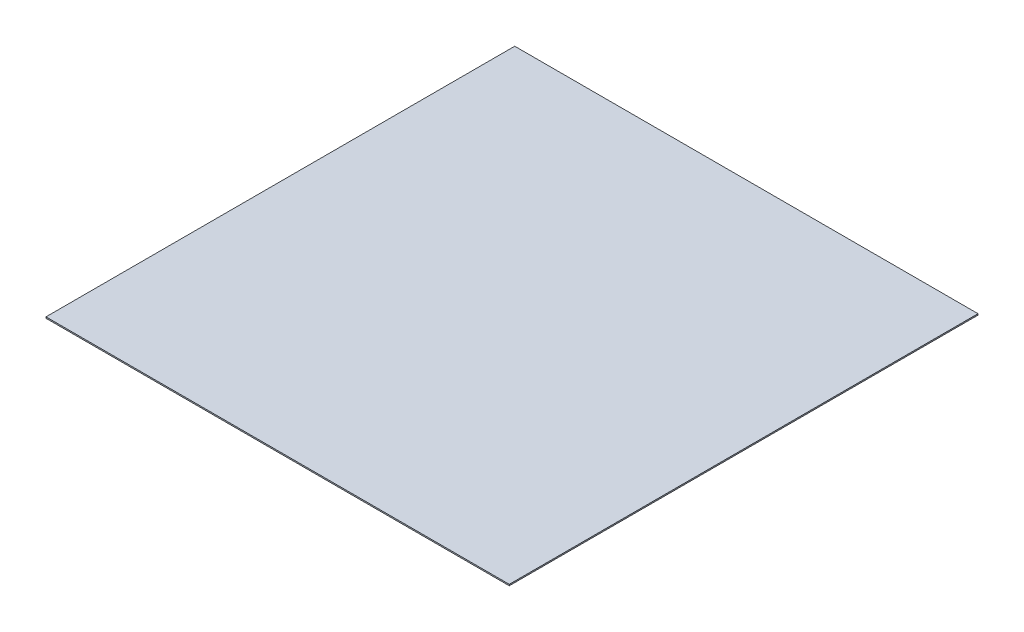
ISO-10303-21;
HEADER;
FILE_DESCRIPTION(('STEP AP214'),'2;1');
FILE_NAME('part.step','',(''),(''),'','','');
FILE_SCHEMA(('AUTOMOTIVE_DESIGN { 1 0 10303 214 1 1 1 1 }'));
ENDSEC;
DATA;
#1=APPLICATION_CONTEXT('core data for automotive mechanical design processes');
#2=APPLICATION_PROTOCOL_DEFINITION('international standard','automotive_design',2000,#1);
#3=PRODUCT_CONTEXT('',#1,'mechanical');
#4=PRODUCT('Part','Part','',(#3));
#5=PRODUCT_RELATED_PRODUCT_CATEGORY('part','',(#4));
#6=PRODUCT_DEFINITION_FORMATION('','',#4);
#7=PRODUCT_DEFINITION_CONTEXT('part definition',#1,'design');
#8=PRODUCT_DEFINITION('design','',#6,#7);
#9=PRODUCT_DEFINITION_SHAPE('','',#8);
#10=(LENGTH_UNIT() NAMED_UNIT(*) SI_UNIT(.MILLI.,.METRE.));
#11=(NAMED_UNIT(*) PLANE_ANGLE_UNIT() SI_UNIT($,.RADIAN.));
#12=(NAMED_UNIT(*) SI_UNIT($,.STERADIAN.) SOLID_ANGLE_UNIT());
#13=UNCERTAINTY_MEASURE_WITH_UNIT(LENGTH_MEASURE(1.E-05),#10,'distance_accuracy_value','');
#14=(GEOMETRIC_REPRESENTATION_CONTEXT(3) GLOBAL_UNCERTAINTY_ASSIGNED_CONTEXT((#13)) GLOBAL_UNIT_ASSIGNED_CONTEXT((#10,
#11,#12)) REPRESENTATION_CONTEXT('',''));
#15=CARTESIAN_POINT('',(0.,0.,0.));
#16=DIRECTION('',(0.,0.,1.));
#17=DIRECTION('',(1.,0.,0.));
#18=AXIS2_PLACEMENT_3D('',#15,#16,#17);
#19=CARTESIAN_POINT('',(895.,5.,-905.55));
#20=DIRECTION('',(-1.,0.,0.));
#21=DIRECTION('',(0.,0.,1.));
#22=AXIS2_PLACEMENT_3D('',#19,#20,#21);
#23=PLANE('',#22);
#24=DIRECTION('',(0.,0.,-1.));
#25=VECTOR('',#24,1.);
#26=CARTESIAN_POINT('',(895.,0.,-905.55));
#27=LINE('',#26,#25);
#28=CARTESIAN_POINT('',(895.,0.,905.55));
#29=VERTEX_POINT('',#28);
#30=CARTESIAN_POINT('',(895.,0.,-905.55));
#31=VERTEX_POINT('',#30);
#32=EDGE_CURVE('E95',#29,#31,#27,.T.);
#33=ORIENTED_EDGE('',*,*,#32,.T.);
#34=DIRECTION('',(0.,-1.,0.));
#35=VECTOR('',#34,1.);
#36=CARTESIAN_POINT('',(895.,5.,-905.55));
#37=LINE('',#36,#35);
#38=CARTESIAN_POINT('',(895.,5.,-905.55));
#39=VERTEX_POINT('',#38);
#40=EDGE_CURVE('E11',#39,#31,#37,.T.);
#41=ORIENTED_EDGE('',*,*,#40,.F.);
#42=DIRECTION('',(0.,0.,-1.));
#43=VECTOR('',#42,1.);
#44=CARTESIAN_POINT('',(895.,5.,-905.55));
#45=LINE('',#44,#43);
#46=CARTESIAN_POINT('',(895.,5.,905.55));
#47=VERTEX_POINT('',#46);
#48=EDGE_CURVE('E83',#47,#39,#45,.T.);
#49=ORIENTED_EDGE('',*,*,#48,.F.);
#50=DIRECTION('',(0.,-1.,0.));
#51=VECTOR('',#50,1.);
#52=CARTESIAN_POINT('',(895.,5.,905.55));
#53=LINE('',#52,#51);
#54=EDGE_CURVE('E91',#47,#29,#53,.T.);
#55=ORIENTED_EDGE('',*,*,#54,.T.);
#56=EDGE_LOOP('',(#33,#41,#49,#55));
#57=FACE_BOUND('',#56,.T.);
#58=ADVANCED_FACE('F32',(#57),#23,.F.);
#59=CARTESIAN_POINT('',(-895.,5.,-905.55));
#60=DIRECTION('',(0.,0.,1.));
#61=DIRECTION('',(1.,0.,0.));
#62=AXIS2_PLACEMENT_3D('',#59,#60,#61);
#63=PLANE('',#62);
#64=DIRECTION('',(-1.,0.,0.));
#65=VECTOR('',#64,1.);
#66=CARTESIAN_POINT('',(-895.,0.,-905.55));
#67=LINE('',#66,#65);
#68=CARTESIAN_POINT('',(-895.,0.,-905.55));
#69=VERTEX_POINT('',#68);
#70=EDGE_CURVE('E87',#31,#69,#67,.T.);
#71=ORIENTED_EDGE('',*,*,#70,.T.);
#72=DIRECTION('',(0.,-1.,0.));
#73=VECTOR('',#72,1.);
#74=CARTESIAN_POINT('',(-895.,5.,-905.55));
#75=LINE('',#74,#73);
#76=CARTESIAN_POINT('',(-895.,5.,-905.55));
#77=VERTEX_POINT('',#76);
#78=EDGE_CURVE('E40',#77,#69,#75,.T.);
#79=ORIENTED_EDGE('',*,*,#78,.F.);
#80=DIRECTION('',(-1.,0.,0.));
#81=VECTOR('',#80,1.);
#82=CARTESIAN_POINT('',(-895.,5.,-905.55));
#83=LINE('',#82,#81);
#84=EDGE_CURVE('E78',#39,#77,#83,.T.);
#85=ORIENTED_EDGE('',*,*,#84,.F.);
#86=ORIENTED_EDGE('',*,*,#40,.T.);
#87=EDGE_LOOP('',(#71,#79,#85,#86));
#88=FACE_BOUND('',#87,.T.);
#89=ADVANCED_FACE('F86',(#88),#63,.F.);
#90=CARTESIAN_POINT('',(-895.,5.,-905.55));
#91=DIRECTION('',(1.,0.,0.));
#92=DIRECTION('',(0.,0.,-1.));
#93=AXIS2_PLACEMENT_3D('',#90,#91,#92);
#94=PLANE('',#93);
#95=DIRECTION('',(0.,0.,1.));
#96=VECTOR('',#95,1.);
#97=CARTESIAN_POINT('',(-895.,0.,-905.55));
#98=LINE('',#97,#96);
#99=CARTESIAN_POINT('',(-895.,0.,905.55));
#100=VERTEX_POINT('',#99);
#101=EDGE_CURVE('E65',#69,#100,#98,.T.);
#102=ORIENTED_EDGE('',*,*,#101,.T.);
#103=DIRECTION('',(0.,-1.,0.));
#104=VECTOR('',#103,1.);
#105=CARTESIAN_POINT('',(-895.,5.,905.55));
#106=LINE('',#105,#104);
#107=CARTESIAN_POINT('',(-895.,5.,905.55));
#108=VERTEX_POINT('',#107);
#109=EDGE_CURVE('E88',#108,#100,#106,.T.);
#110=ORIENTED_EDGE('',*,*,#109,.F.);
#111=DIRECTION('',(0.,0.,1.));
#112=VECTOR('',#111,1.);
#113=CARTESIAN_POINT('',(-895.,5.,-905.55));
#114=LINE('',#113,#112);
#115=EDGE_CURVE('E81',#77,#108,#114,.T.);
#116=ORIENTED_EDGE('',*,*,#115,.F.);
#117=ORIENTED_EDGE('',*,*,#78,.T.);
#118=EDGE_LOOP('',(#102,#110,#116,#117));
#119=FACE_BOUND('',#118,.T.);
#120=ADVANCED_FACE('F89',(#119),#94,.F.);
#121=CARTESIAN_POINT('',(-895.,5.,905.55));
#122=DIRECTION('',(0.,0.,-1.));
#123=DIRECTION('',(-1.,0.,0.));
#124=AXIS2_PLACEMENT_3D('',#121,#122,#123);
#125=PLANE('',#124);
#126=DIRECTION('',(1.,0.,0.));
#127=VECTOR('',#126,1.);
#128=CARTESIAN_POINT('',(-895.,0.,905.55));
#129=LINE('',#128,#127);
#130=EDGE_CURVE('E71',#100,#29,#129,.T.);
#131=ORIENTED_EDGE('',*,*,#130,.T.);
#132=ORIENTED_EDGE('',*,*,#54,.F.);
#133=DIRECTION('',(1.,0.,0.));
#134=VECTOR('',#133,1.);
#135=CARTESIAN_POINT('',(-895.,5.,905.55));
#136=LINE('',#135,#134);
#137=EDGE_CURVE('E48',#108,#47,#136,.T.);
#138=ORIENTED_EDGE('',*,*,#137,.F.);
#139=ORIENTED_EDGE('',*,*,#109,.T.);
#140=EDGE_LOOP('',(#131,#132,#138,#139));
#141=FACE_BOUND('',#140,.T.);
#142=ADVANCED_FACE('F102',(#141),#125,.F.);
#143=CARTESIAN_POINT('',(0.,5.,0.));
#144=DIRECTION('',(0.,1.,0.));
#145=DIRECTION('',(0.,0.,1.));
#146=AXIS2_PLACEMENT_3D('',#143,#144,#145);
#147=PLANE('',#146);
#148=ORIENTED_EDGE('',*,*,#48,.T.);
#149=ORIENTED_EDGE('',*,*,#84,.T.);
#150=ORIENTED_EDGE('',*,*,#115,.T.);
#151=ORIENTED_EDGE('',*,*,#137,.T.);
#152=EDGE_LOOP('',(#148,#149,#150,#151));
#153=FACE_BOUND('',#152,.T.);
#154=ADVANCED_FACE('F79',(#153),#147,.T.);
#155=CARTESIAN_POINT('',(0.,0.,0.));
#156=DIRECTION('',(0.,1.,0.));
#157=DIRECTION('',(0.,0.,1.));
#158=AXIS2_PLACEMENT_3D('',#155,#156,#157);
#159=PLANE('',#158);
#160=ORIENTED_EDGE('',*,*,#32,.F.);
#161=ORIENTED_EDGE('',*,*,#130,.F.);
#162=ORIENTED_EDGE('',*,*,#101,.F.);
#163=ORIENTED_EDGE('',*,*,#70,.F.);
#164=EDGE_LOOP('',(#160,#161,#162,#163));
#165=FACE_BOUND('',#164,.T.);
#166=ADVANCED_FACE('F105',(#165),#159,.F.);
#167=CLOSED_SHELL('',(#58,#89,#120,#142,#154,#166));
#168=MANIFOLD_SOLID_BREP('B2',#167);
#169=ADVANCED_BREP_SHAPE_REPRESENTATION('',(#18,#168),#14);
#170=SHAPE_DEFINITION_REPRESENTATION(#9,#169);
ENDSEC;
END-ISO-10303-21;
